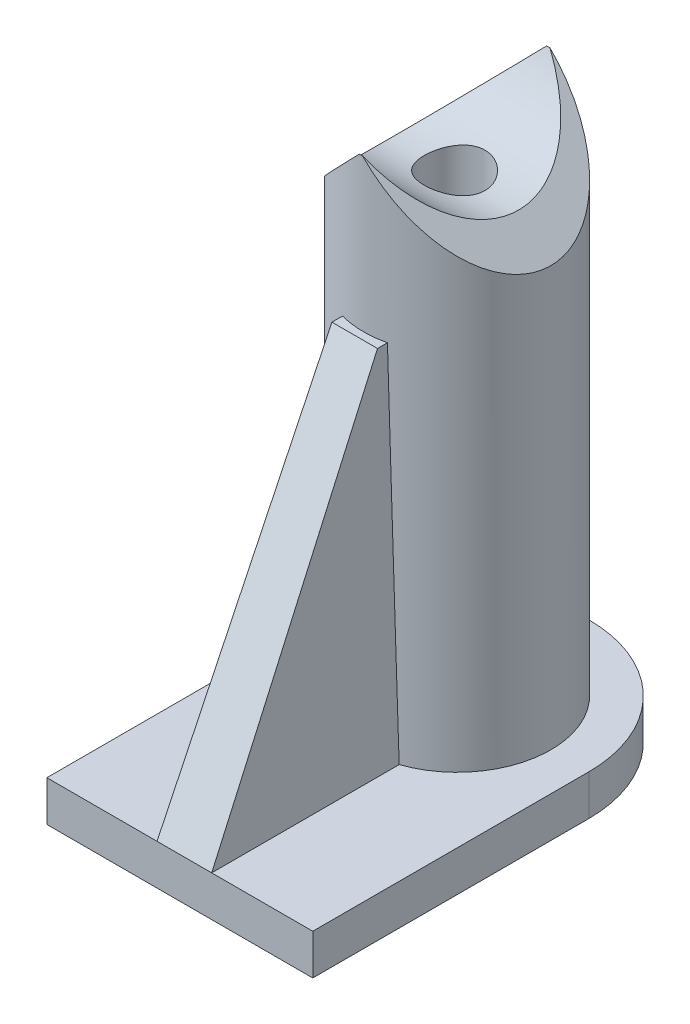
ISO-10303-21;
HEADER;
FILE_DESCRIPTION(('STEP AP214'),'2;1');
FILE_NAME('part.step','',(''),(''),'','','');
FILE_SCHEMA(('AUTOMOTIVE_DESIGN { 1 0 10303 214 1 1 1 1 }'));
ENDSEC;
DATA;
#1=APPLICATION_CONTEXT('core data for automotive mechanical design processes');
#2=APPLICATION_PROTOCOL_DEFINITION('international standard','automotive_design',2000,#1);
#3=PRODUCT_CONTEXT('',#1,'mechanical');
#4=PRODUCT('Part','Part','',(#3));
#5=PRODUCT_RELATED_PRODUCT_CATEGORY('part','',(#4));
#6=PRODUCT_DEFINITION_FORMATION('','',#4);
#7=PRODUCT_DEFINITION_CONTEXT('part definition',#1,'design');
#8=PRODUCT_DEFINITION('design','',#6,#7);
#9=PRODUCT_DEFINITION_SHAPE('','',#8);
#10=(LENGTH_UNIT() NAMED_UNIT(*) SI_UNIT(.MILLI.,.METRE.));
#11=(NAMED_UNIT(*) PLANE_ANGLE_UNIT() SI_UNIT($,.RADIAN.));
#12=(NAMED_UNIT(*) SI_UNIT($,.STERADIAN.) SOLID_ANGLE_UNIT());
#13=UNCERTAINTY_MEASURE_WITH_UNIT(LENGTH_MEASURE(1.E-05),#10,'distance_accuracy_value','');
#14=(GEOMETRIC_REPRESENTATION_CONTEXT(3) GLOBAL_UNCERTAINTY_ASSIGNED_CONTEXT((#13)) GLOBAL_UNIT_ASSIGNED_CONTEXT((#10,
#11,#12)) REPRESENTATION_CONTEXT('',''));
#15=CARTESIAN_POINT('',(0.,0.,0.));
#16=DIRECTION('',(0.,0.,1.));
#17=DIRECTION('',(1.,0.,0.));
#18=AXIS2_PLACEMENT_3D('',#15,#16,#17);
#19=CARTESIAN_POINT('',(-5.2,21.9,5.2));
#20=DIRECTION('',(0.,-1.,0.));
#21=DIRECTION('',(0.,0.,-1.));
#22=AXIS2_PLACEMENT_3D('',#19,#20,#21);
#23=CYLINDRICAL_SURFACE('',#22,3.7);
#24=CARTESIAN_POINT('',(-5.2,15.9,5.2));
#25=DIRECTION('',(0.,-1.,0.));
#26=DIRECTION('',(0.,0.,1.));
#27=AXIS2_PLACEMENT_3D('',#24,#25,#26);
#28=CIRCLE('',#27,3.7);
#29=CARTESIAN_POINT('',(-6.15,15.9,8.77596140918774));
#30=VERTEX_POINT('',#29);
#31=CARTESIAN_POINT('',(-4.34999999997192,15.9,8.80104151599954));
#32=VERTEX_POINT('',#31);
#33=EDGE_CURVE('E141',#30,#32,#28,.F.);
#34=ORIENTED_EDGE('',*,*,#33,.T.);
#35=CARTESIAN_POINT('',(-5.2,49.7751500020347,5.2));
#36=DIRECTION('',(-0.999685340837746,-0.0250842443402034,0.));
#37=DIRECTION('',(0.0250842443402034,-0.999685340837746,0.));
#38=AXIS2_PLACEMENT_3D('',#35,#36,#37);
#39=ELLIPSE('',#38,147.502948457167,3.7);
#40=CARTESIAN_POINT('',(-3.99118240068989,1.6,8.69696439953256));
#41=VERTEX_POINT('',#40);
#42=EDGE_CURVE('E175',#32,#41,#39,.F.);
#43=ORIENTED_EDGE('',*,*,#42,.T.);
#44=CARTESIAN_POINT('',(-5.2,1.6,5.2));
#45=DIRECTION('',(0.,-1.,0.));
#46=DIRECTION('',(0.,0.,1.));
#47=AXIS2_PLACEMENT_3D('',#44,#45,#46);
#48=CIRCLE('',#47,3.7);
#49=CARTESIAN_POINT('',(-6.15,1.6,8.77596140918774));
#50=VERTEX_POINT('',#49);
#51=EDGE_CURVE('E165',#50,#41,#48,.T.);
#52=ORIENTED_EDGE('',*,*,#51,.F.);
#53=DIRECTION('',(0.,-1.,0.));
#54=VECTOR('',#53,1.);
#55=CARTESIAN_POINT('',(-6.15,21.9,8.77596140918774));
#56=LINE('',#55,#54);
#57=EDGE_CURVE('E171',#50,#30,#56,.F.);
#58=ORIENTED_EDGE('',*,*,#57,.T.);
#59=EDGE_LOOP('',(#34,#43,#52,#58));
#60=FACE_BOUND('',#59,.T.);
#61=CARTESIAN_POINT('',(-5.2,21.8589822391826,5.2));
#62=DIRECTION('',(0.707106781186554,0.707106781186541,0.));
#63=DIRECTION('',(0.707106781186541,-0.707106781186554,0.));
#64=AXIS2_PLACEMENT_3D('',#61,#62,#63);
#65=ELLIPSE('',#64,5.2325901807805,3.7);
#66=CARTESIAN_POINT('',(-5.24048307471345,21.8994653138961,8.89977852319053));
#67=VERTEX_POINT('',#66);
#68=CARTESIAN_POINT('',(-5.24048307471566,21.8994653138983,1.50022147680951));
#69=VERTEX_POINT('',#68);
#70=EDGE_CURVE('E302',#67,#69,#65,.T.);
#71=ORIENTED_EDGE('',*,*,#70,.F.);
#72=CARTESIAN_POINT('',(-5.2,21.9,1.5));
#73=CARTESIAN_POINT('',(-5.30220118854143,21.8999861552881,1.50000329053625));
#74=CARTESIAN_POINT('',(-5.40441808191666,21.8894947726479,1.50429955744503));
#75=CARTESIAN_POINT('',(-5.60491412544944,21.8505158880821,1.52082991556372));
#76=CARTESIAN_POINT('',(-5.70317145254614,21.8219401894823,1.53310291703705));
#77=CARTESIAN_POINT('',(-5.87121813598477,21.7608106945932,1.56064452022894));
#78=CARTESIAN_POINT('',(-5.9422303586275,21.7308096358502,1.57451135835405));
#79=CARTESIAN_POINT('',(-6.08114170375435,21.6657767440427,1.60574743157836));
#80=CARTESIAN_POINT('',(-6.14903848089882,21.6307412003586,1.62311925384308));
#81=CARTESIAN_POINT('',(-6.3488882967008,21.5203913532359,1.68014901349179));
#82=CARTESIAN_POINT('',(-6.4766289158008,21.4399884665495,1.72465651225778));
#83=CARTESIAN_POINT('',(-6.71490698259938,21.2792030770967,1.82206581039771));
#84=CARTESIAN_POINT('',(-6.82602362636766,21.1991854825654,1.8741982756588));
#85=CARTESIAN_POINT('',(-7.04178237073929,21.0375117296007,1.988652379036));
#86=CARTESIAN_POINT('',(-7.14641969850108,20.9558544205898,2.05098140797828));
#87=CARTESIAN_POINT('',(-7.34933835839138,20.7933716974848,2.18584035487792));
#88=CARTESIAN_POINT('',(-7.44762715750579,20.7125454036964,2.25835795817353));
#89=CARTESIAN_POINT('',(-7.63769373918767,20.5534781770391,2.41383547186427));
#90=CARTESIAN_POINT('',(-7.72947509825423,20.4752358368578,2.4967895756838));
#91=CARTESIAN_POINT('',(-7.94897003387618,20.2858132103856,2.71652359058631));
#92=CARTESIAN_POINT('',(-8.07243404960116,20.17713330954,2.85985218041348));
#93=CARTESIAN_POINT('',(-8.29972739769978,19.9748992604763,3.17056111703932));
#94=CARTESIAN_POINT('',(-8.40359109775338,19.8813186793218,3.33789844179852));
#95=CARTESIAN_POINT('',(-8.56769351525543,19.7325174236787,3.65917248392195));
#96=CARTESIAN_POINT('',(-8.63250893189407,19.6733658437209,3.80889636296508));
#97=CARTESIAN_POINT('',(-8.71531935387495,19.5975488037141,4.04267961874061));
#98=CARTESIAN_POINT('',(-8.74052581938986,19.5744234473959,4.12216415322763));
#99=CARTESIAN_POINT('',(-8.78574586885089,19.5328819696268,4.28378172649424));
#100=CARTESIAN_POINT('',(-8.80576173225587,19.5144637810694,4.36591358482189));
#101=CARTESIAN_POINT('',(-8.84037438059293,19.4825850155868,4.53291625862229));
#102=CARTESIAN_POINT('',(-8.85493005397909,19.4691620551388,4.6178028219736));
#103=CARTESIAN_POINT('',(-8.8781188954863,19.4477664657864,4.78902392698739));
#104=CARTESIAN_POINT('',(-8.88675481697309,19.4397913030353,4.87535777632688));
#105=CARTESIAN_POINT('',(-8.89792707773942,19.4294723859938,5.04875009447969));
#106=CARTESIAN_POINT('',(-8.90046426153741,19.4271278520061,5.13580846129038));
#107=CARTESIAN_POINT('',(-8.89939502498305,19.4281155077124,5.3098263625634));
#108=CARTESIAN_POINT('',(-8.89578913137733,19.4314472106896,5.39678590485979));
#109=CARTESIAN_POINT('',(-8.87729749793132,19.4485254769984,5.63732403115231));
#110=CARTESIAN_POINT('',(-8.85581456543738,19.4683619230852,5.79004772530705));
#111=CARTESIAN_POINT('',(-8.79494752668963,19.5244260631929,6.0886169113682));
#112=CARTESIAN_POINT('',(-8.75556053690702,19.5606563975187,6.23446129115233));
#113=CARTESIAN_POINT('',(-8.65915777708952,19.6490013357018,6.52218096357648));
#114=CARTESIAN_POINT('',(-8.60149315320657,19.7016993707302,6.66365684117055));
#115=CARTESIAN_POINT('',(-8.47185455136396,19.8195068617113,6.93422221612513));
#116=CARTESIAN_POINT('',(-8.39987406841147,19.8846219593055,7.06330604297315));
#117=CARTESIAN_POINT('',(-8.20303543467088,20.0613385184196,7.3727465047799));
#118=CARTESIAN_POINT('',(-8.07025366533381,20.1794003471286,7.5444517801073));
#119=CARTESIAN_POINT('',(-7.8552833242326,20.3668029792136,7.77891327632925));
#120=CARTESIAN_POINT('',(-7.78083598440948,20.4311217894035,7.85333779192149));
#121=CARTESIAN_POINT('',(-7.62710408869393,20.5622521462416,7.99464681061368));
#122=CARTESIAN_POINT('',(-7.54782037954333,20.6290632557519,8.06153262776773));
#123=CARTESIAN_POINT('',(-7.38270755339974,20.7658470685964,8.18947787001646));
#124=CARTESIAN_POINT('',(-7.29676403040008,20.8358570312878,8.25034867814242));
#125=CARTESIAN_POINT('',(-7.12021819440276,20.9762227226005,8.36446055571283));
#126=CARTESIAN_POINT('',(-7.02961589020273,21.0465784505687,8.41770163956452));
#127=CARTESIAN_POINT('',(-6.84371911662066,21.1859742738523,8.51651169910498));
#128=CARTESIAN_POINT('',(-6.7484354647991,21.2550169341498,8.56209737795193));
#129=CARTESIAN_POINT('',(-6.55240484099297,21.3897878350268,8.64562805067155));
#130=CARTESIAN_POINT('',(-6.4516626553041,21.4555188848057,8.68357960515771));
#131=CARTESIAN_POINT('',(-6.25803884625461,21.5715853266806,8.74674847699734));
#132=CARTESIAN_POINT('',(-6.16602551800486,21.6227886319086,8.77300413514137));
#133=CARTESIAN_POINT('',(-5.97609902991764,21.7166474417492,8.81900546456139));
#134=CARTESIAN_POINT('',(-5.87819132229475,21.759310692452,8.83875704582132));
#135=CARTESIAN_POINT('',(-5.69398275994262,21.824211571132,8.86783907755175));
#136=CARTESIAN_POINT('',(-5.60871212833711,21.8487318921207,8.8783978229424));
#137=CARTESIAN_POINT('',(-5.43499064708258,21.8843944220393,8.89355218953716));
#138=CARTESIAN_POINT('',(-5.34654977895478,21.8955753716575,8.89816508205651));
#139=CARTESIAN_POINT('',(-5.1684178303178,21.9022688925758,8.90094179408382));
#140=CARTESIAN_POINT('',(-5.0787224795727,21.8976906186907,8.89906822153492));
#141=CARTESIAN_POINT('',(-4.90163506783468,21.8737114802237,8.88902357604518));
#142=CARTESIAN_POINT('',(-4.81424891151067,21.8542758263313,8.88083772218301));
#143=CARTESIAN_POINT('',(-4.60424539800062,21.7926146959105,8.85389120673591));
#144=CARTESIAN_POINT('',(-4.48398705089301,21.7440104710673,8.83199328062005));
#145=CARTESIAN_POINT('',(-4.25200081237684,21.633367465955,8.77848967156498));
#146=CARTESIAN_POINT('',(-4.1403135975003,21.5712694115346,8.74684089138749));
#147=CARTESIAN_POINT('',(-3.92158780233785,21.4386589659623,8.67407787442097));
#148=CARTESIAN_POINT('',(-3.81471718222212,21.3679847873628,8.63276107585714));
#149=CARTESIAN_POINT('',(-3.60705469743022,21.223251063502,8.54146635361594));
#150=CARTESIAN_POINT('',(-3.50626843930291,21.1491885031527,8.49148060116859));
#151=CARTESIAN_POINT('',(-3.31016484905568,21.0001428963845,8.38293440136031));
#152=CARTESIAN_POINT('',(-3.21484707794647,20.9251599244411,8.32437464363216));
#153=CARTESIAN_POINT('',(-3.02945771872571,20.7759509852149,8.19854928097493));
#154=CARTESIAN_POINT('',(-2.93938733571104,20.7017251950273,8.13128168757391));
#155=CARTESIAN_POINT('',(-2.77391470184935,20.5631483153687,7.99541075793236));
#156=CARTESIAN_POINT('',(-2.69796703209827,20.498581013182,7.92769548082345));
#157=CARTESIAN_POINT('',(-2.55080753368635,20.3721089310101,7.78501348280166));
#158=CARTESIAN_POINT('',(-2.47959710877104,20.3102049421235,7.71004462851065));
#159=CARTESIAN_POINT('',(-2.27414484646608,20.1301473592317,7.47435968492877));
#160=CARTESIAN_POINT('',(-2.14759265128003,20.0172317576592,7.30247020197285));
#161=CARTESIAN_POINT('',(-1.95006835475449,19.8394328351368,6.97612761517814));
#162=CARTESIAN_POINT('',(-1.87310739690448,19.7695950018666,6.8280285474842));
#163=CARTESIAN_POINT('',(-1.77191614604515,19.6773654333157,6.59479098951195));
#164=CARTESIAN_POINT('',(-1.74055307160102,19.6487030021413,6.51516994994541));
#165=CARTESIAN_POINT('',(-1.68304572006378,19.5960517222737,6.35258736956468));
#166=CARTESIAN_POINT('',(-1.65689908409703,19.5720607612598,6.26962735912183));
#167=CARTESIAN_POINT('',(-1.61005302250855,19.5290191966639,6.10004987450945));
#168=CARTESIAN_POINT('',(-1.58940608299807,19.5100162190577,6.01340571641963));
#169=CARTESIAN_POINT('',(-1.55430073790507,19.477676756696,5.83787279007397));
#170=CARTESIAN_POINT('',(-1.53983915151879,19.4643373594831,5.7489852004641));
#171=CARTESIAN_POINT('',(-1.51741320435203,19.4436416114366,5.56974057516832));
#172=CARTESIAN_POINT('',(-1.50944598374084,19.4362826270987,5.47938420416652));
#173=CARTESIAN_POINT('',(-1.50018550159053,19.4277284614055,5.2980455479931));
#174=CARTESIAN_POINT('',(-1.49889136310207,19.4265324701348,5.20706334663922));
#175=CARTESIAN_POINT('',(-1.50273133795836,19.4300800848953,5.03750184025578));
#176=CARTESIAN_POINT('',(-1.50703154373526,19.4340531783333,4.95888591500431));
#177=CARTESIAN_POINT('',(-1.52058113616982,19.4465646949622,4.80243951206051));
#178=CARTESIAN_POINT('',(-1.52983212305178,19.4551045942658,4.72460929662258));
#179=CARTESIAN_POINT('',(-1.56479954429822,19.4873583402911,4.4931912479431));
#180=CARTESIAN_POINT('',(-1.59773431492487,19.5177098625377,4.34152290040802));
#181=CARTESIAN_POINT('',(-1.68085260857059,19.5940587072025,4.04714024146694));
#182=CARTESIAN_POINT('',(-1.73105379554968,19.6400720515401,3.90443527731985));
#183=CARTESIAN_POINT('',(-1.84617469648876,19.7450843648457,3.63029179150034));
#184=CARTESIAN_POINT('',(-1.91109842686952,19.8040868772282,3.49885635775012));
#185=CARTESIAN_POINT('',(-2.08763353221639,19.9634822492083,3.18784480500316));
#186=CARTESIAN_POINT('',(-2.20666130525578,20.0701139465709,3.01561878353005));
#187=CARTESIAN_POINT('',(-2.40073927814134,20.2412345821472,2.77829174664166));
#188=CARTESIAN_POINT('',(-2.46817827853062,20.3002718261999,2.7025488874264));
#189=CARTESIAN_POINT('',(-2.60773559369747,20.4212238697834,2.55798548731715));
#190=CARTESIAN_POINT('',(-2.67985264960703,20.483137893909,2.4891630967287));
#191=CARTESIAN_POINT('',(-2.84711905796357,20.6248893632137,2.34179502736361));
#192=CARTESIAN_POINT('',(-2.94348391482636,20.7053028363687,2.26518625776051));
#193=CARTESIAN_POINT('',(-3.14256875860694,20.8676092341126,2.12233850521157));
#194=CARTESIAN_POINT('',(-3.24529297337529,20.9495031167383,2.05610652656885));
#195=CARTESIAN_POINT('',(-3.45696348842228,21.1124812684457,1.93400324514867));
#196=CARTESIAN_POINT('',(-3.56589791858349,21.1935667556203,1.87811299002446));
#197=CARTESIAN_POINT('',(-3.79085081751589,21.3521007693557,1.77662039437046));
#198=CARTESIAN_POINT('',(-3.90686071313561,21.4295535038604,1.73100590574176));
#199=CARTESIAN_POINT('',(-4.1246629455183,21.5619174797247,1.65822286333507));
#200=CARTESIAN_POINT('',(-4.2249209188819,21.6183044183054,1.62919461275267));
#201=CARTESIAN_POINT('',(-4.43242739644737,21.7208711168502,1.57892349221635));
#202=CARTESIAN_POINT('',(-4.53966258091512,21.7670696270273,1.55766627264631));
#203=CARTESIAN_POINT('',(-4.73869205280249,21.8341938119413,1.52779556067708));
#204=CARTESIAN_POINT('',(-4.82908163688891,21.8583726846856,1.51747486604692));
#205=CARTESIAN_POINT('',(-5.01298508059262,21.8912532891681,1.50358816134696));
#206=CARTESIAN_POINT('',(-5.10648596606411,21.9000126679041,1.49999698916105));
#207=CARTESIAN_POINT('',(-5.2,21.9,1.5));
#208=B_SPLINE_CURVE_WITH_KNOTS('',3,(#72,#73,#74,#75,#76,#77,#78,#79,#80,#81,#82,#83,#84,#85,
#86,#87,#88,#89,#90,#91,#92,#93,#94,#95,#96,#97,#98,#99,#100,#101,#102,#103,#104,#105,#106,#107,
#108,#109,#110,#111,#112,#113,#114,#115,#116,#117,#118,#119,#120,#121,#122,#123,#124,#125,#126,
#127,#128,#129,#130,#131,#132,#133,#134,#135,#136,#137,#138,#139,#140,#141,#142,#143,#144,#145,
#146,#147,#148,#149,#150,#151,#152,#153,#154,#155,#156,#157,#158,#159,#160,#161,#162,#163,#164,
#165,#166,#167,#168,#169,#170,#171,#172,#173,#174,#175,#176,#177,#178,#179,#180,#181,#182,#183,
#184,#185,#186,#187,#188,#189,#190,#191,#192,#193,#194,#195,#196,#197,#198,#199,#200,#201,#202,
#203,#204,#205,#206,#207),.UNSPECIFIED.,.T.,.F.,(4,2,2,2,2,2,2,2,2,2,2,2,2,2,2,2,2,2,2,2,2,2,2,
2,2,2,2,2,2,2,2,2,2,2,2,2,2,2,2,2,2,2,2,2,2,2,2,2,2,2,2,2,2,2,2,2,2,2,2,2,2,2,2,2,2,2,2,4),(0.,
0.306146909046892,0.613798516304356,0.848451404357704,1.08327813673251,1.55414308601822,
1.9932268897018,2.43263037842291,2.87150726894867,3.31014105167947,3.96223233682261,
4.61316938333827,5.13152126219224,5.39084450968198,5.65005368147635,5.91117711399101,
6.17217901150641,6.43314476488294,6.69408814251727,7.15823252357075,7.62245168365977,
8.1054554126339,8.58867911749745,9.32554281108332,9.69539213393251,10.065176889124,
10.4442527338627,10.8233278627804,11.2015648363416,11.579475358725,11.9045857812986,
12.2293999691114,12.496479259933,12.762780986333,13.0306203929502,13.299088887505,
13.6914940503146,14.0856590855335,14.4889686421615,14.8926443349392,15.2962875766972,
15.7000231552703,16.0612053843314,16.4224941669151,17.1428322337963,17.6834011663558,
17.953857332953,18.2241909206684,18.4970188144603,18.7697062379472,19.0422735170162,
19.3148049754884,19.5510072288074,19.7872858751379,20.2593895560146,20.7319776540032,
21.2046948330189,21.9053717739188,22.257180507078,22.608894957883,23.0494760386993,
23.4903532409564,23.9304143071714,24.3699523669107,24.7252798850365,25.0799479178643,
25.3611256348037,25.6412498960825),.UNSPECIFIED.);
#209=CARTESIAN_POINT('',(-5.36614753596505,21.8910185891588,8.89626771166439));
#210=VERTEX_POINT('',#209);
#211=EDGE_CURVE('E238',#210,#67,#208,.T.);
#212=ORIENTED_EDGE('',*,*,#211,.F.);
#213=CARTESIAN_POINT('',(-5.2,22.0617277897651,5.2));
#214=DIRECTION('',(-0.716616613550526,0.697467296138949,0.));
#215=DIRECTION('',(-0.697467296138949,-0.716616613550526,0.));
#216=AXIS2_PLACEMENT_3D('',#213,#214,#215);
#217=ELLIPSE('',#216,5.30490823079809,3.7);
#218=CARTESIAN_POINT('',(-7.79060151478678,19.4,7.84173878186024));
#219=VERTEX_POINT('',#218);
#220=EDGE_CURVE('E299',#219,#210,#217,.T.);
#221=ORIENTED_EDGE('',*,*,#220,.F.);
#222=DIRECTION('',(0.,-1.,0.));
#223=VECTOR('',#222,1.);
#224=CARTESIAN_POINT('',(-7.79060151478678,22.2116350067327,7.84173878186024));
#225=LINE('',#224,#223);
#226=CARTESIAN_POINT('',(-7.79060151478678,16.4,7.84173878186024));
#227=VERTEX_POINT('',#226);
#228=EDGE_CURVE('E309',#219,#227,#225,.T.);
#229=ORIENTED_EDGE('',*,*,#228,.T.);
#230=CARTESIAN_POINT('',(-5.2,16.4,5.2));
#231=DIRECTION('',(0.,-1.,0.));
#232=DIRECTION('',(0.,0.,1.));
#233=AXIS2_PLACEMENT_3D('',#230,#231,#232);
#234=CIRCLE('',#233,3.7);
#235=CARTESIAN_POINT('',(-7.79060151478678,16.4,2.55826121813976));
#236=VERTEX_POINT('',#235);
#237=EDGE_CURVE('E305',#227,#236,#234,.T.);
#238=ORIENTED_EDGE('',*,*,#237,.T.);
#239=DIRECTION('',(0.,-1.,0.));
#240=VECTOR('',#239,1.);
#241=CARTESIAN_POINT('',(-7.79060151478678,22.2116350067327,2.55826121813976));
#242=LINE('',#241,#240);
#243=CARTESIAN_POINT('',(-7.79060151478678,19.4,2.55826121813976));
#244=VERTEX_POINT('',#243);
#245=EDGE_CURVE('E239',#244,#236,#242,.T.);
#246=ORIENTED_EDGE('',*,*,#245,.F.);
#247=CARTESIAN_POINT('',(-5.36614753596487,21.8910185891588,1.5037322883356));
#248=VERTEX_POINT('',#247);
#249=EDGE_CURVE('E296',#248,#244,#217,.T.);
#250=ORIENTED_EDGE('',*,*,#249,.F.);
#251=EDGE_CURVE('E232',#69,#248,#208,.T.);
#252=ORIENTED_EDGE('',*,*,#251,.F.);
#253=EDGE_LOOP('',(#71,#212,#221,#229,#238,#246,#250,#252));
#254=FACE_BOUND('',#253,.T.);
#255=ADVANCED_FACE('F32',(#60,#254),#23,.T.);
#256=CARTESIAN_POINT('',(9.8,23.4322947838148,5.2));
#257=DIRECTION('',(-1.,0.,0.));
#258=DIRECTION('',(0.,0.,-1.));
#259=AXIS2_PLACEMENT_3D('',#256,#257,#258);
#260=CYLINDRICAL_SURFACE('',#259,4.00473810685618);
#261=CARTESIAN_POINT('',(-5.3,19.6115713831345,4.));
#262=CARTESIAN_POINT('',(-5.23424040619088,19.6115706960729,4.00000082883482));
#263=CARTESIAN_POINT('',(-5.16847261018046,19.6098550943304,4.00542378782113));
#264=CARTESIAN_POINT('',(-5.03885953647324,19.6032053936528,4.02691661695094));
#265=CARTESIAN_POINT('',(-4.97501491216385,19.5982702135022,4.04299006382453));
#266=CARTESIAN_POINT('',(-4.85114332255254,19.5857894048023,4.08518931591675));
#267=CARTESIAN_POINT('',(-4.79111021067222,19.5782481124115,4.11129843142027));
#268=CARTESIAN_POINT('',(-4.6762616171418,19.561410659837,4.17277306690415));
#269=CARTESIAN_POINT('',(-4.62144691422616,19.5521142383538,4.20813996546455));
#270=CARTESIAN_POINT('',(-4.51686045622883,19.5324848252323,4.28832172644045));
#271=CARTESIAN_POINT('',(-4.4672778007565,19.5221297896242,4.33337790374892));
#272=CARTESIAN_POINT('',(-4.37624700078883,19.5017382334039,4.43114208188345));
#273=CARTESIAN_POINT('',(-4.33479989947944,19.4917017537769,4.48385106248896));
#274=CARTESIAN_POINT('',(-4.26039595405093,19.4728278014941,4.59676947464099));
#275=CARTESIAN_POINT('',(-4.22763186404594,19.4640193295765,4.65711118700928));
#276=CARTESIAN_POINT('',(-4.17278946567554,19.4488499494873,4.78275669998628));
#277=CARTESIAN_POINT('',(-4.15070885844682,19.4424885148246,4.848059429585));
#278=CARTESIAN_POINT('',(-4.11848585327858,19.4330859464286,4.97979498948568));
#279=CARTESIAN_POINT('',(-4.10802069175961,19.4299552239126,5.04614236081902));
#280=CARTESIAN_POINT('',(-4.09830511879445,19.4270513535784,5.17972011986294));
#281=CARTESIAN_POINT('',(-4.09905235721133,19.4272775021546,5.24695031957971));
#282=CARTESIAN_POINT('',(-4.11152360640448,19.4309985414453,5.37812115858799));
#283=CARTESIAN_POINT('',(-4.12289809885467,19.4343893464164,5.44209844670505));
#284=CARTESIAN_POINT('',(-4.15573010512406,19.4439322421114,5.56719047061501));
#285=CARTESIAN_POINT('',(-4.17718825690359,19.4500845075429,5.62830502502299));
#286=CARTESIAN_POINT('',(-4.22981547850191,19.4646030602442,5.74676828879743));
#287=CARTESIAN_POINT('',(-4.26109458260207,19.4729942641522,5.80406493597114));
#288=CARTESIAN_POINT('',(-4.33238879304053,19.4911004972362,5.91270802745417));
#289=CARTESIAN_POINT('',(-4.37240596803636,19.5008158396847,5.96405305835951));
#290=CARTESIAN_POINT('',(-4.46185355458913,19.5209715357214,6.06142125112925));
#291=CARTESIAN_POINT('',(-4.5115868143578,19.5314254025533,6.10716377496546));
#292=CARTESIAN_POINT('',(-4.61812023657929,19.5515531123865,6.18973860628559));
#293=CARTESIAN_POINT('',(-4.67492109703341,19.5612268781886,6.22657003264382));
#294=CARTESIAN_POINT('',(-4.79471480587425,19.5787635398588,6.29056893074744));
#295=CARTESIAN_POINT('',(-4.85776158992098,19.5866082664635,6.31764078801835));
#296=CARTESIAN_POINT('',(-4.98780895324396,19.5993829242661,6.36069987942919));
#297=CARTESIAN_POINT('',(-5.05480823857378,19.6043138036218,6.3766907195941));
#298=CARTESIAN_POINT('',(-5.18818835302224,19.6104944423928,6.39660973509687));
#299=CARTESIAN_POINT('',(-5.25449951069602,19.6118742868647,6.40096441747525));
#300=CARTESIAN_POINT('',(-5.38690695740766,19.6111562942423,6.3986783694323));
#301=CARTESIAN_POINT('',(-5.45300327514756,19.6090589425822,6.39203917381173));
#302=CARTESIAN_POINT('',(-5.58132732902586,19.6017505251393,6.36833362264782));
#303=CARTESIAN_POINT('',(-5.64361092274324,19.5966215070327,6.35154176932997));
#304=CARTESIAN_POINT('',(-5.76447248578279,19.5839126198259,6.30832575010049));
#305=CARTESIAN_POINT('',(-5.82304988224111,19.5763323729425,6.28190009934861));
#306=CARTESIAN_POINT('',(-5.93657143691481,19.5593227023763,6.21935698932968));
#307=CARTESIAN_POINT('',(-5.99137623616537,19.5498491831854,6.18299887275123));
#308=CARTESIAN_POINT('',(-6.09426265454174,19.5302152139843,6.10190884046201));
#309=CARTESIAN_POINT('',(-6.14234266351001,19.5200546003197,6.05717492525856));
#310=CARTESIAN_POINT('',(-6.23227922774707,19.499728456033,5.95859829776346));
#311=CARTESIAN_POINT('',(-6.27383342885074,19.4895771344326,5.90447611670756));
#312=CARTESIAN_POINT('',(-6.34727716756395,19.4707985404727,5.78978504595997));
#313=CARTESIAN_POINT('',(-6.37916718597974,19.4621711923023,5.7292164771875));
#314=CARTESIAN_POINT('',(-6.4320696842099,19.4474653447567,5.60375286684333));
#315=CARTESIAN_POINT('',(-6.45316346106704,19.4413678631771,5.53889444221241));
#316=CARTESIAN_POINT('',(-6.48408312784867,19.4323249564029,5.40633797092195));
#317=CARTESIAN_POINT('',(-6.49391223332035,19.4293786317136,5.33864074033391));
#318=CARTESIAN_POINT('',(-6.50177947776745,19.4270246327306,5.20512287129608));
#319=CARTESIAN_POINT('',(-6.50025614689746,19.4274853435651,5.1393300708334));
#320=CARTESIAN_POINT('',(-6.48650975734242,19.4315835851709,5.00897861343441));
#321=CARTESIAN_POINT('',(-6.47428730286221,19.4352209365497,4.94441988701739));
#322=CARTESIAN_POINT('',(-6.43976076134664,19.4452263745653,4.81904102628078));
#323=CARTESIAN_POINT('',(-6.41756585284446,19.4515648514961,4.75818830184563));
#324=CARTESIAN_POINT('',(-6.36382208199501,19.4663170619105,4.64103865777939));
#325=CARTESIAN_POINT('',(-6.332271684541,19.474731135933,4.58474248774734));
#326=CARTESIAN_POINT('',(-6.25954400033369,19.4930845408269,4.47634956431047));
#327=CARTESIAN_POINT('',(-6.2180914032056,19.5030640064996,4.42444438601523));
#328=CARTESIAN_POINT('',(-6.12723209825788,19.5232946800755,4.32818016310275));
#329=CARTESIAN_POINT('',(-6.07782310191564,19.5335459654521,4.28382329720166));
#330=CARTESIAN_POINT('',(-5.97069158844833,19.5535181648007,4.20259132165106));
#331=CARTESIAN_POINT('',(-5.91276567237377,19.5632142692353,4.16597767965583));
#332=CARTESIAN_POINT('',(-5.79130017969921,19.5805806096673,4.10305103977588));
#333=CARTESIAN_POINT('',(-5.7277633302984,19.5882518227108,4.07673307107963));
#334=CARTESIAN_POINT('',(-5.60398372684793,19.5999379777974,4.03752825238679));
#335=CARTESIAN_POINT('',(-5.54413163921375,19.6042593375595,4.02349387114836));
#336=CARTESIAN_POINT('',(-5.42285520983435,19.6100760795481,4.00473028504809));
#337=CARTESIAN_POINT('',(-5.3614311839028,19.6115720249725,3.99999922572051));
#338=CARTESIAN_POINT('',(-5.3,19.6115713831345,4.));
#339=B_SPLINE_CURVE_WITH_KNOTS('',3,(#261,#262,#263,#264,#265,#266,#267,#268,#269,#270,#271,
#272,#273,#274,#275,#276,#277,#278,#279,#280,#281,#282,#283,#284,#285,#286,#287,#288,#289,#290,
#291,#292,#293,#294,#295,#296,#297,#298,#299,#300,#301,#302,#303,#304,#305,#306,#307,#308,#309,
#310,#311,#312,#313,#314,#315,#316,#317,#318,#319,#320,#321,#322,#323,#324,#325,#326,#327,#328,
#329,#330,#331,#332,#333,#334,#335,#336,#337,#338),.UNSPECIFIED.,.T.,.F.,(4,2,2,2,2,2,2,2,2,2,2,
2,2,2,2,2,2,2,2,2,2,2,2,2,2,2,2,2,2,2,2,2,2,2,2,2,2,2,4),(0.,0.197052178311741,
0.394170565788285,0.590962546068643,0.787783847405182,0.990235081861163,1.19271225880543,
1.39936575285447,1.60597475957146,1.80668651756704,2.00735620664583,2.20165003620309,
2.39595615975442,2.59252203541954,2.78913449678985,2.99330890316097,3.197503489971,
3.40364743764491,3.60972426966042,3.80813685024686,4.00652173377248,4.19976872242487,
4.39304550849671,4.59149970229392,4.79000133214151,4.99597426229815,5.20193694333814,
5.40632499795418,5.61065469460841,5.80713349017025,6.00360119082494,6.19796847801459,
6.39236767586099,6.59297634414738,6.79364281750412,7.00027171804097,7.20680073344513,
7.39091930220644,7.5750011662072),.UNSPECIFIED.);
#340=CARTESIAN_POINT('',(-5.3,19.6115713831345,4.));
#341=VERTEX_POINT('',#340);
#342=EDGE_CURVE('E182',#341,#341,#339,.T.);
#343=ORIENTED_EDGE('',*,*,#342,.T.);
#344=EDGE_LOOP('',(#343));
#345=FACE_BOUND('',#344,.T.);
#346=ORIENTED_EDGE('',*,*,#251,.T.);
#347=CARTESIAN_POINT('',(-3.86605708346487,23.4322947838148,5.2));
#348=DIRECTION('',(-0.716616613550526,0.697467296138949,0.));
#349=DIRECTION('',(-0.697467296138949,-0.716616613550526,0.));
#350=AXIS2_PLACEMENT_3D('',#347,#348,#349);
#351=ELLIPSE('',#350,5.58839696307685,4.00473810685618);
#352=EDGE_CURVE('E295',#210,#248,#351,.F.);
#353=ORIENTED_EDGE('',*,*,#352,.F.);
#354=ORIENTED_EDGE('',*,*,#211,.T.);
#355=CARTESIAN_POINT('',(-6.77331254463211,23.4322947838148,5.2));
#356=DIRECTION('',(0.707106781186554,0.707106781186541,0.));
#357=DIRECTION('',(-0.707106781186541,0.707106781186554,0.));
#358=AXIS2_PLACEMENT_3D('',#355,#356,#357);
#359=ELLIPSE('',#358,5.66355494446831,4.00473810685618);
#360=EDGE_CURVE('E287',#69,#67,#359,.F.);
#361=ORIENTED_EDGE('',*,*,#360,.F.);
#362=EDGE_LOOP('',(#346,#353,#354,#361));
#363=FACE_BOUND('',#362,.T.);
#364=ADVANCED_FACE('F224',(#345,#363),#260,.F.);
#365=CARTESIAN_POINT('',(0.,1.6,0.));
#366=DIRECTION('',(0.,1.,0.));
#367=DIRECTION('',(0.,0.,1.));
#368=AXIS2_PLACEMENT_3D('',#365,#366,#367);
#369=PLANE('',#368);
#370=DIRECTION('',(0.,0.,1.));
#371=VECTOR('',#370,1.);
#372=CARTESIAN_POINT('',(-6.15,1.6,-500000.));
#373=LINE('',#372,#371);
#374=CARTESIAN_POINT('',(-6.15,1.6,16.1));
#375=VERTEX_POINT('',#374);
#376=EDGE_CURVE('E167',#50,#375,#373,.T.);
#377=ORIENTED_EDGE('',*,*,#376,.F.);
#378=ORIENTED_EDGE('',*,*,#51,.T.);
#379=DIRECTION('',(0.,0.,1.));
#380=VECTOR('',#379,1.);
#381=CARTESIAN_POINT('',(-3.99118240068989,1.6,-500000.));
#382=LINE('',#381,#380);
#383=CARTESIAN_POINT('',(-3.99118240068989,1.6,16.1));
#384=VERTEX_POINT('',#383);
#385=EDGE_CURVE('E138',#41,#384,#382,.T.);
#386=ORIENTED_EDGE('',*,*,#385,.T.);
#387=DIRECTION('',(-1.,0.,0.));
#388=VECTOR('',#387,1.);
#389=CARTESIAN_POINT('',(0.,1.6,16.1));
#390=LINE('',#389,#388);
#391=CARTESIAN_POINT('',(0.,1.6,16.1));
#392=VERTEX_POINT('',#391);
#393=EDGE_CURVE('E153',#392,#384,#390,.T.);
#394=ORIENTED_EDGE('',*,*,#393,.F.);
#395=DIRECTION('',(0.,0.,1.));
#396=VECTOR('',#395,1.);
#397=CARTESIAN_POINT('',(0.,1.6,0.));
#398=LINE('',#397,#396);
#399=CARTESIAN_POINT('',(0.,1.6,5.2));
#400=VERTEX_POINT('',#399);
#401=EDGE_CURVE('E243',#400,#392,#398,.T.);
#402=ORIENTED_EDGE('',*,*,#401,.F.);
#403=CARTESIAN_POINT('',(-5.2,1.6,5.2));
#404=DIRECTION('',(0.,-1.,0.));
#405=DIRECTION('',(0.,0.,1.));
#406=AXIS2_PLACEMENT_3D('',#403,#404,#405);
#407=CIRCLE('',#406,5.2);
#408=CARTESIAN_POINT('',(-5.2,1.6,0.));
#409=VERTEX_POINT('',#408);
#410=EDGE_CURVE('E280',#409,#400,#407,.T.);
#411=ORIENTED_EDGE('',*,*,#410,.F.);
#412=DIRECTION('',(1.,0.,0.));
#413=VECTOR('',#412,1.);
#414=CARTESIAN_POINT('',(0.,1.6,0.));
#415=LINE('',#414,#413);
#416=CARTESIAN_POINT('',(-5.3,1.6,0.));
#417=VERTEX_POINT('',#416);
#418=EDGE_CURVE('E248',#417,#409,#415,.T.);
#419=ORIENTED_EDGE('',*,*,#418,.F.);
#420=CARTESIAN_POINT('',(-5.3,1.6,5.2));
#421=DIRECTION('',(0.,-1.,0.));
#422=DIRECTION('',(0.,0.,1.));
#423=AXIS2_PLACEMENT_3D('',#420,#421,#422);
#424=CIRCLE('',#423,5.2);
#425=CARTESIAN_POINT('',(-10.5,1.6,5.2));
#426=VERTEX_POINT('',#425);
#427=EDGE_CURVE('E277',#426,#417,#424,.T.);
#428=ORIENTED_EDGE('',*,*,#427,.F.);
#429=DIRECTION('',(0.,0.,-1.));
#430=VECTOR('',#429,1.);
#431=CARTESIAN_POINT('',(-10.5,1.6,0.));
#432=LINE('',#431,#430);
#433=CARTESIAN_POINT('',(-10.5,1.6,16.1));
#434=VERTEX_POINT('',#433);
#435=EDGE_CURVE('E160',#434,#426,#432,.T.);
#436=ORIENTED_EDGE('',*,*,#435,.F.);
#437=EDGE_CURVE('E161',#375,#434,#390,.T.);
#438=ORIENTED_EDGE('',*,*,#437,.F.);
#439=EDGE_LOOP('',(#377,#378,#386,#394,#402,#411,#419,#428,#436,#438));
#440=FACE_BOUND('',#439,.T.);
#441=ADVANCED_FACE('F163',(#440),#369,.T.);
#442=CARTESIAN_POINT('',(0.,1.6,0.));
#443=DIRECTION('',(-1.,0.,0.));
#444=DIRECTION('',(0.,0.,-1.));
#445=AXIS2_PLACEMENT_3D('',#442,#443,#444);
#446=PLANE('',#445);
#447=ORIENTED_EDGE('',*,*,#401,.T.);
#448=DIRECTION('',(0.,-1.,0.));
#449=VECTOR('',#448,1.);
#450=CARTESIAN_POINT('',(0.,1.6,16.1));
#451=LINE('',#450,#449);
#452=CARTESIAN_POINT('',(0.,0.,16.1));
#453=VERTEX_POINT('',#452);
#454=EDGE_CURVE('E156',#392,#453,#451,.T.);
#455=ORIENTED_EDGE('',*,*,#454,.T.);
#456=DIRECTION('',(0.,0.,1.));
#457=VECTOR('',#456,1.);
#458=CARTESIAN_POINT('',(0.,0.,0.));
#459=LINE('',#458,#457);
#460=CARTESIAN_POINT('',(0.,0.,5.2));
#461=VERTEX_POINT('',#460);
#462=EDGE_CURVE('E242',#461,#453,#459,.T.);
#463=ORIENTED_EDGE('',*,*,#462,.F.);
#464=DIRECTION('',(0.,-1.,0.));
#465=VECTOR('',#464,1.);
#466=CARTESIAN_POINT('',(0.,1.6,5.2));
#467=LINE('',#466,#465);
#468=EDGE_CURVE('E265',#400,#461,#467,.T.);
#469=ORIENTED_EDGE('',*,*,#468,.F.);
#470=EDGE_LOOP('',(#447,#455,#463,#469));
#471=FACE_BOUND('',#470,.T.);
#472=ADVANCED_FACE('F340',(#471),#446,.F.);
#473=CARTESIAN_POINT('',(0.,1.6,16.1));
#474=DIRECTION('',(0.,0.,-1.));
#475=DIRECTION('',(1.,0.,0.));
#476=AXIS2_PLACEMENT_3D('',#473,#474,#475);
#477=PLANE('',#476);
#478=ORIENTED_EDGE('',*,*,#437,.T.);
#479=DIRECTION('',(0.,-1.,0.));
#480=VECTOR('',#479,1.);
#481=CARTESIAN_POINT('',(-10.5,1.6,16.1));
#482=LINE('',#481,#480);
#483=CARTESIAN_POINT('',(-10.5,0.,16.1));
#484=VERTEX_POINT('',#483);
#485=EDGE_CURVE('E251',#434,#484,#482,.T.);
#486=ORIENTED_EDGE('',*,*,#485,.T.);
#487=DIRECTION('',(-1.,0.,0.));
#488=VECTOR('',#487,1.);
#489=CARTESIAN_POINT('',(0.,0.,16.1));
#490=LINE('',#489,#488);
#491=EDGE_CURVE('E254',#453,#484,#490,.T.);
#492=ORIENTED_EDGE('',*,*,#491,.F.);
#493=ORIENTED_EDGE('',*,*,#454,.F.);
#494=ORIENTED_EDGE('',*,*,#393,.T.);
#495=DIRECTION('',(-1.,0.,0.));
#496=VECTOR('',#495,1.);
#497=CARTESIAN_POINT('',(0.00100000000000013,1.6,16.1));
#498=LINE('',#497,#496);
#499=EDGE_CURVE('E144',#384,#375,#498,.T.);
#500=ORIENTED_EDGE('',*,*,#499,.T.);
#501=EDGE_LOOP('',(#478,#486,#492,#493,#494,#500));
#502=FACE_BOUND('',#501,.T.);
#503=ADVANCED_FACE('F154',(#502),#477,.F.);
#504=CARTESIAN_POINT('',(-10.5,1.6,0.));
#505=DIRECTION('',(1.,0.,0.));
#506=DIRECTION('',(0.,0.,1.));
#507=AXIS2_PLACEMENT_3D('',#504,#505,#506);
#508=PLANE('',#507);
#509=DIRECTION('',(0.,0.,-1.));
#510=VECTOR('',#509,1.);
#511=CARTESIAN_POINT('',(-10.5,0.,0.));
#512=LINE('',#511,#510);
#513=CARTESIAN_POINT('',(-10.5,0.,5.2));
#514=VERTEX_POINT('',#513);
#515=EDGE_CURVE('E257',#484,#514,#512,.T.);
#516=ORIENTED_EDGE('',*,*,#515,.F.);
#517=ORIENTED_EDGE('',*,*,#485,.F.);
#518=ORIENTED_EDGE('',*,*,#435,.T.);
#519=DIRECTION('',(0.,-1.,0.));
#520=VECTOR('',#519,1.);
#521=CARTESIAN_POINT('',(-10.5,1.6,5.2));
#522=LINE('',#521,#520);
#523=EDGE_CURVE('E283',#514,#426,#522,.F.);
#524=ORIENTED_EDGE('',*,*,#523,.F.);
#525=EDGE_LOOP('',(#516,#517,#518,#524));
#526=FACE_BOUND('',#525,.T.);
#527=ADVANCED_FACE('F334',(#526),#508,.F.);
#528=CARTESIAN_POINT('',(0.,1.6,0.));
#529=DIRECTION('',(0.,0.,1.));
#530=DIRECTION('',(-1.,0.,0.));
#531=AXIS2_PLACEMENT_3D('',#528,#529,#530);
#532=PLANE('',#531);
#533=DIRECTION('',(1.,0.,0.));
#534=VECTOR('',#533,1.);
#535=CARTESIAN_POINT('',(0.,0.,0.));
#536=LINE('',#535,#534);
#537=CARTESIAN_POINT('',(-5.3,0.,0.));
#538=VERTEX_POINT('',#537);
#539=CARTESIAN_POINT('',(-5.2,0.,0.));
#540=VERTEX_POINT('',#539);
#541=EDGE_CURVE('E244',#538,#540,#536,.T.);
#542=ORIENTED_EDGE('',*,*,#541,.F.);
#543=DIRECTION('',(0.,-1.,0.));
#544=VECTOR('',#543,1.);
#545=CARTESIAN_POINT('',(-5.3,1.6,0.));
#546=LINE('',#545,#544);
#547=EDGE_CURVE('E272',#417,#538,#546,.T.);
#548=ORIENTED_EDGE('',*,*,#547,.F.);
#549=ORIENTED_EDGE('',*,*,#418,.T.);
#550=DIRECTION('',(0.,-1.,0.));
#551=VECTOR('',#550,1.);
#552=CARTESIAN_POINT('',(-5.2,1.6,0.));
#553=LINE('',#552,#551);
#554=EDGE_CURVE('E275',#540,#409,#553,.F.);
#555=ORIENTED_EDGE('',*,*,#554,.F.);
#556=EDGE_LOOP('',(#542,#548,#549,#555));
#557=FACE_BOUND('',#556,.T.);
#558=ADVANCED_FACE('F348',(#557),#532,.F.);
#559=CARTESIAN_POINT('',(0.,0.,0.));
#560=DIRECTION('',(0.,1.,0.));
#561=DIRECTION('',(0.,0.,1.));
#562=AXIS2_PLACEMENT_3D('',#559,#560,#561);
#563=PLANE('',#562);
#564=CARTESIAN_POINT('',(-5.3,0.,5.2));
#565=DIRECTION('',(0.,-1.,0.));
#566=DIRECTION('',(0.,0.,1.));
#567=AXIS2_PLACEMENT_3D('',#564,#565,#566);
#568=CIRCLE('',#567,3.275);
#569=CARTESIAN_POINT('',(-5.3,0.,8.475));
#570=VERTEX_POINT('',#569);
#571=EDGE_CURVE('E11',#570,#570,#568,.T.);
#572=ORIENTED_EDGE('',*,*,#571,.F.);
#573=EDGE_LOOP('',(#572));
#574=FACE_BOUND('',#573,.T.);
#575=ORIENTED_EDGE('',*,*,#462,.T.);
#576=ORIENTED_EDGE('',*,*,#491,.T.);
#577=ORIENTED_EDGE('',*,*,#515,.T.);
#578=CARTESIAN_POINT('',(-5.3,0.,5.2));
#579=DIRECTION('',(0.,-1.,0.));
#580=DIRECTION('',(0.,0.,1.));
#581=AXIS2_PLACEMENT_3D('',#578,#579,#580);
#582=CIRCLE('',#581,5.2);
#583=EDGE_CURVE('E268',#538,#514,#582,.F.);
#584=ORIENTED_EDGE('',*,*,#583,.F.);
#585=ORIENTED_EDGE('',*,*,#541,.T.);
#586=CARTESIAN_POINT('',(-5.2,0.,5.2));
#587=DIRECTION('',(0.,-1.,0.));
#588=DIRECTION('',(0.,0.,1.));
#589=AXIS2_PLACEMENT_3D('',#586,#587,#588);
#590=CIRCLE('',#589,5.2);
#591=EDGE_CURVE('E270',#461,#540,#590,.F.);
#592=ORIENTED_EDGE('',*,*,#591,.F.);
#593=EDGE_LOOP('',(#575,#576,#577,#584,#585,#592));
#594=FACE_BOUND('',#593,.T.);
#595=ADVANCED_FACE('F337',(#574,#594),#563,.F.);
#596=CARTESIAN_POINT('',(-5.2,1.6,5.2));
#597=DIRECTION('',(0.,-1.,0.));
#598=DIRECTION('',(0.,0.,-1.));
#599=AXIS2_PLACEMENT_3D('',#596,#597,#598);
#600=CYLINDRICAL_SURFACE('',#599,5.2);
#601=ORIENTED_EDGE('',*,*,#410,.T.);
#602=ORIENTED_EDGE('',*,*,#468,.T.);
#603=ORIENTED_EDGE('',*,*,#591,.T.);
#604=ORIENTED_EDGE('',*,*,#554,.T.);
#605=EDGE_LOOP('',(#601,#602,#603,#604));
#606=FACE_BOUND('',#605,.T.);
#607=ADVANCED_FACE('F344',(#606),#600,.T.);
#608=CARTESIAN_POINT('',(-5.3,1.6,5.2));
#609=DIRECTION('',(0.,-1.,0.));
#610=DIRECTION('',(0.,0.,-1.));
#611=AXIS2_PLACEMENT_3D('',#608,#609,#610);
#612=CYLINDRICAL_SURFACE('',#611,5.2);
#613=ORIENTED_EDGE('',*,*,#427,.T.);
#614=ORIENTED_EDGE('',*,*,#547,.T.);
#615=ORIENTED_EDGE('',*,*,#583,.T.);
#616=ORIENTED_EDGE('',*,*,#523,.T.);
#617=EDGE_LOOP('',(#613,#614,#615,#616));
#618=FACE_BOUND('',#617,.T.);
#619=ADVANCED_FACE('F222',(#618),#612,.T.);
#620=CARTESIAN_POINT('',(-7.79060151478678,22.2116350067327,2.55826121813976));
#621=DIRECTION('',(-1.,0.,0.));
#622=DIRECTION('',(0.,0.,-1.));
#623=AXIS2_PLACEMENT_3D('',#620,#621,#622);
#624=PLANE('',#623);
#625=DIRECTION('',(0.,0.,-1.));
#626=VECTOR('',#625,1.);
#627=CARTESIAN_POINT('',(-7.79060151478678,19.4,2.55826121813976));
#628=LINE('',#627,#626);
#629=EDGE_CURVE('E285',#219,#244,#628,.T.);
#630=ORIENTED_EDGE('',*,*,#629,.T.);
#631=ORIENTED_EDGE('',*,*,#245,.T.);
#632=DIRECTION('',(0.,0.,1.));
#633=VECTOR('',#632,1.);
#634=CARTESIAN_POINT('',(-7.79060151478678,16.4,2.55826121813976));
#635=LINE('',#634,#633);
#636=EDGE_CURVE('E308',#236,#227,#635,.T.);
#637=ORIENTED_EDGE('',*,*,#636,.T.);
#638=ORIENTED_EDGE('',*,*,#228,.F.);
#639=EDGE_LOOP('',(#630,#631,#637,#638));
#640=FACE_BOUND('',#639,.T.);
#641=ADVANCED_FACE('F218',(#640),#624,.T.);
#642=CARTESIAN_POINT('',(-5.2,16.4,5.2));
#643=DIRECTION('',(0.,1.,0.));
#644=DIRECTION('',(0.,0.,1.));
#645=AXIS2_PLACEMENT_3D('',#642,#643,#644);
#646=PLANE('',#645);
#647=ORIENTED_EDGE('',*,*,#237,.F.);
#648=ORIENTED_EDGE('',*,*,#636,.F.);
#649=EDGE_LOOP('',(#647,#648));
#650=FACE_BOUND('',#649,.T.);
#651=ADVANCED_FACE('F211',(#650),#646,.T.);
#652=CARTESIAN_POINT('',(-5.3,21.9589822391827,-4.2));
#653=DIRECTION('',(0.716616613550526,-0.697467296138949,0.));
#654=DIRECTION('',(-0.697467296138949,-0.716616613550526,0.));
#655=AXIS2_PLACEMENT_3D('',#652,#653,#654);
#656=PLANE('',#655);
#657=ORIENTED_EDGE('',*,*,#629,.F.);
#658=ORIENTED_EDGE('',*,*,#220,.T.);
#659=ORIENTED_EDGE('',*,*,#352,.T.);
#660=ORIENTED_EDGE('',*,*,#249,.T.);
#661=EDGE_LOOP('',(#657,#658,#659,#660));
#662=FACE_BOUND('',#661,.T.);
#663=ADVANCED_FACE('F208',(#662),#656,.F.);
#664=CARTESIAN_POINT('',(-5.3,21.9589822391827,-4.2));
#665=DIRECTION('',(-0.707106781186554,-0.707106781186541,0.));
#666=DIRECTION('',(-0.707106781186541,0.707106781186554,0.));
#667=AXIS2_PLACEMENT_3D('',#664,#665,#666);
#668=PLANE('',#667);
#669=ORIENTED_EDGE('',*,*,#70,.T.);
#670=ORIENTED_EDGE('',*,*,#360,.T.);
#671=EDGE_LOOP('',(#669,#670));
#672=FACE_BOUND('',#671,.T.);
#673=ADVANCED_FACE('F206',(#672),#668,.F.);
#674=CARTESIAN_POINT('',(-5.3,16.3,5.2));
#675=DIRECTION('',(0.,-1.,0.));
#676=DIRECTION('',(0.,0.,-1.));
#677=AXIS2_PLACEMENT_3D('',#674,#675,#676);
#678=CYLINDRICAL_SURFACE('',#677,2.275);
#679=CARTESIAN_POINT('',(-5.3,1.,5.2));
#680=DIRECTION('',(0.,-1.,0.));
#681=DIRECTION('',(0.,0.,1.));
#682=AXIS2_PLACEMENT_3D('',#679,#680,#681);
#683=CIRCLE('',#682,2.275);
#684=CARTESIAN_POINT('',(-5.3,1.,7.475));
#685=VERTEX_POINT('',#684);
#686=EDGE_CURVE('E40',#685,#685,#683,.F.);
#687=ORIENTED_EDGE('',*,*,#686,.F.);
#688=EDGE_LOOP('',(#687));
#689=FACE_BOUND('',#688,.T.);
#690=CARTESIAN_POINT('',(-5.3,16.3,5.2));
#691=DIRECTION('',(0.,1.,0.));
#692=DIRECTION('',(0.,0.,-1.));
#693=AXIS2_PLACEMENT_3D('',#690,#691,#692);
#694=CIRCLE('',#693,2.275);
#695=CARTESIAN_POINT('',(-5.3,16.3,2.925));
#696=VERTEX_POINT('',#695);
#697=EDGE_CURVE('E189',#696,#696,#694,.T.);
#698=ORIENTED_EDGE('',*,*,#697,.T.);
#699=EDGE_LOOP('',(#698));
#700=FACE_BOUND('',#699,.T.);
#701=ADVANCED_FACE('F202',(#689,#700),#678,.F.);
#702=CARTESIAN_POINT('',(-5.3,16.3,5.2));
#703=DIRECTION('',(0.,-1.,0.));
#704=DIRECTION('',(0.,0.,-1.));
#705=AXIS2_PLACEMENT_3D('',#702,#703,#704);
#706=PLANE('',#705);
#707=CARTESIAN_POINT('',(-5.3,16.3,5.2));
#708=DIRECTION('',(0.,1.,0.));
#709=DIRECTION('',(0.,0.,-1.));
#710=AXIS2_PLACEMENT_3D('',#707,#708,#709);
#711=CIRCLE('',#710,1.2);
#712=CARTESIAN_POINT('',(-5.3,16.3,4.));
#713=VERTEX_POINT('',#712);
#714=EDGE_CURVE('E179',#713,#713,#711,.T.);
#715=ORIENTED_EDGE('',*,*,#714,.T.);
#716=EDGE_LOOP('',(#715));
#717=FACE_BOUND('',#716,.T.);
#718=ORIENTED_EDGE('',*,*,#697,.F.);
#719=EDGE_LOOP('',(#718));
#720=FACE_BOUND('',#719,.T.);
#721=ADVANCED_FACE('F199',(#717,#720),#706,.T.);
#722=CARTESIAN_POINT('',(-5.3,1.,5.2));
#723=DIRECTION('',(0.,-1.,0.));
#724=DIRECTION('',(0.,0.,-1.));
#725=AXIS2_PLACEMENT_3D('',#722,#723,#724);
#726=CONICAL_SURFACE('',#725,2.275,0.78539816339745);
#727=ORIENTED_EDGE('',*,*,#571,.T.);
#728=EDGE_LOOP('',(#727));
#729=FACE_BOUND('',#728,.T.);
#730=ORIENTED_EDGE('',*,*,#686,.T.);
#731=EDGE_LOOP('',(#730));
#732=FACE_BOUND('',#731,.T.);
#733=ADVANCED_FACE('F34',(#729,#732),#726,.F.);
#734=CARTESIAN_POINT('',(-5.3,21.906017893391,5.2));
#735=DIRECTION('',(0.,-1.,0.));
#736=DIRECTION('',(0.,0.,-1.));
#737=AXIS2_PLACEMENT_3D('',#734,#735,#736);
#738=CYLINDRICAL_SURFACE('',#737,1.2);
#739=ORIENTED_EDGE('',*,*,#714,.F.);
#740=EDGE_LOOP('',(#739));
#741=FACE_BOUND('',#740,.T.);
#742=ORIENTED_EDGE('',*,*,#342,.F.);
#743=EDGE_LOOP('',(#742));
#744=FACE_BOUND('',#743,.T.);
#745=ADVANCED_FACE('F193',(#741,#744),#738,.F.);
#746=CARTESIAN_POINT('',(-6.15,1.6,-500000.));
#747=DIRECTION('',(-1.,0.,0.));
#748=DIRECTION('',(0.,0.,-1.));
#749=AXIS2_PLACEMENT_3D('',#746,#747,#748);
#750=PLANE('',#749);
#751=DIRECTION('',(0.,0.900476019142608,-0.4349056667245));
#752=VECTOR('',#751,1.);
#753=CARTESIAN_POINT('',(-6.15,6.60774489026023,13.6813940804792));
#754=LINE('',#753,#752);
#755=CARTESIAN_POINT('',(-6.15,15.9,9.19348511013141));
#756=VERTEX_POINT('',#755);
#757=EDGE_CURVE('E147',#375,#756,#754,.T.);
#758=ORIENTED_EDGE('',*,*,#757,.T.);
#759=DIRECTION('',(0.,0.,1.));
#760=VECTOR('',#759,1.);
#761=CARTESIAN_POINT('',(-6.15,15.9,-500000.));
#762=LINE('',#761,#760);
#763=EDGE_CURVE('E54',#30,#756,#762,.T.);
#764=ORIENTED_EDGE('',*,*,#763,.F.);
#765=ORIENTED_EDGE('',*,*,#57,.F.);
#766=ORIENTED_EDGE('',*,*,#376,.T.);
#767=EDGE_LOOP('',(#758,#764,#765,#766));
#768=FACE_BOUND('',#767,.T.);
#769=ADVANCED_FACE('F197',(#768),#750,.T.);
#770=CARTESIAN_POINT('',(-4.35,15.9,-500000.));
#771=DIRECTION('',(0.999685340837746,0.0250842443402034,0.));
#772=DIRECTION('',(0.0250842443402034,-0.999685340837746,0.));
#773=AXIS2_PLACEMENT_3D('',#770,#771,#772);
#774=PLANE('',#773);
#775=DIRECTION('',(-0.0225891047183369,0.90024624793569,-0.434794693419477));
#776=VECTOR('',#775,1.);
#777=CARTESIAN_POINT('',(-4.11473623637912,6.52400554976382,13.7218379267732));
#778=LINE('',#777,#776);
#779=CARTESIAN_POINT('',(-4.35,15.9,9.19348511015101));
#780=VERTEX_POINT('',#779);
#781=EDGE_CURVE('E133',#384,#780,#778,.T.);
#782=ORIENTED_EDGE('',*,*,#781,.F.);
#783=ORIENTED_EDGE('',*,*,#385,.F.);
#784=ORIENTED_EDGE('',*,*,#42,.F.);
#785=DIRECTION('',(0.,0.,1.));
#786=VECTOR('',#785,1.);
#787=CARTESIAN_POINT('',(-4.35,15.9,-500000.));
#788=LINE('',#787,#786);
#789=EDGE_CURVE('E140',#32,#780,#788,.T.);
#790=ORIENTED_EDGE('',*,*,#789,.T.);
#791=EDGE_LOOP('',(#782,#783,#784,#790));
#792=FACE_BOUND('',#791,.T.);
#793=ADVANCED_FACE('F135',(#792),#774,.T.);
#794=CARTESIAN_POINT('',(-6.15,15.9,-500000.));
#795=DIRECTION('',(0.,1.,0.));
#796=DIRECTION('',(0.,0.,1.));
#797=AXIS2_PLACEMENT_3D('',#794,#795,#796);
#798=PLANE('',#797);
#799=DIRECTION('',(-1.,0.,0.));
#800=VECTOR('',#799,1.);
#801=CARTESIAN_POINT('',(0.00100000000000013,15.9,9.19348511015101));
#802=LINE('',#801,#800);
#803=EDGE_CURVE('E47',#780,#756,#802,.T.);
#804=ORIENTED_EDGE('',*,*,#803,.F.);
#805=ORIENTED_EDGE('',*,*,#789,.F.);
#806=ORIENTED_EDGE('',*,*,#33,.F.);
#807=ORIENTED_EDGE('',*,*,#763,.T.);
#808=EDGE_LOOP('',(#804,#805,#806,#807));
#809=FACE_BOUND('',#808,.T.);
#810=ADVANCED_FACE('F327',(#809),#798,.T.);
#811=CARTESIAN_POINT('',(0.00100000000000013,6.60774489026023,13.6813940804792));
#812=DIRECTION('',(0.,-0.4349056667245,-0.900476019142608));
#813=DIRECTION('',(0.,0.900476019142608,-0.4349056667245));
#814=AXIS2_PLACEMENT_3D('',#811,#812,#813);
#815=PLANE('',#814);
#816=ORIENTED_EDGE('',*,*,#499,.F.);
#817=ORIENTED_EDGE('',*,*,#781,.T.);
#818=ORIENTED_EDGE('',*,*,#803,.T.);
#819=ORIENTED_EDGE('',*,*,#757,.F.);
#820=EDGE_LOOP('',(#816,#817,#818,#819));
#821=FACE_BOUND('',#820,.T.);
#822=ADVANCED_FACE('F146',(#821),#815,.F.);
#823=CLOSED_SHELL('',(#255,#364,#441,#472,#503,#527,#558,#595,#607,#619,#641,#651,#663,#673,
#701,#721,#733,#745,#769,#793,#810,#822));
#824=MANIFOLD_SOLID_BREP('B2',#823);
#825=ADVANCED_BREP_SHAPE_REPRESENTATION('',(#18,#824),#14);
#826=SHAPE_DEFINITION_REPRESENTATION(#9,#825);
ENDSEC;
END-ISO-10303-21;
